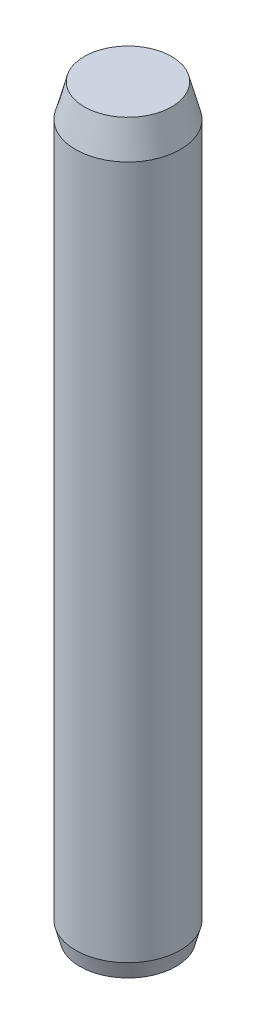
ISO-10303-21;
HEADER;
FILE_DESCRIPTION(('STEP AP214'),'2;1');
FILE_NAME('part.step','',(''),(''),'','','');
FILE_SCHEMA(('AUTOMOTIVE_DESIGN { 1 0 10303 214 1 1 1 1 }'));
ENDSEC;
DATA;
#1=APPLICATION_CONTEXT('core data for automotive mechanical design processes');
#2=APPLICATION_PROTOCOL_DEFINITION('international standard','automotive_design',2000,#1);
#3=PRODUCT_CONTEXT('',#1,'mechanical');
#4=PRODUCT('Part','Part','',(#3));
#5=PRODUCT_RELATED_PRODUCT_CATEGORY('part','',(#4));
#6=PRODUCT_DEFINITION_FORMATION('','',#4);
#7=PRODUCT_DEFINITION_CONTEXT('part definition',#1,'design');
#8=PRODUCT_DEFINITION('design','',#6,#7);
#9=PRODUCT_DEFINITION_SHAPE('','',#8);
#10=(LENGTH_UNIT() NAMED_UNIT(*) SI_UNIT(.MILLI.,.METRE.));
#11=(NAMED_UNIT(*) PLANE_ANGLE_UNIT() SI_UNIT($,.RADIAN.));
#12=(NAMED_UNIT(*) SI_UNIT($,.STERADIAN.) SOLID_ANGLE_UNIT());
#13=UNCERTAINTY_MEASURE_WITH_UNIT(LENGTH_MEASURE(1.E-05),#10,'distance_accuracy_value','');
#14=(GEOMETRIC_REPRESENTATION_CONTEXT(3) GLOBAL_UNCERTAINTY_ASSIGNED_CONTEXT((#13)) GLOBAL_UNIT_ASSIGNED_CONTEXT((#10,
#11,#12)) REPRESENTATION_CONTEXT('',''));
#15=CARTESIAN_POINT('',(0.,0.,0.));
#16=DIRECTION('',(0.,0.,1.));
#17=DIRECTION('',(1.,0.,0.));
#18=AXIS2_PLACEMENT_3D('',#15,#16,#17);
#19=CARTESIAN_POINT('',(0.,170.,0.));
#20=DIRECTION('',(0.,-1.,0.));
#21=DIRECTION('',(0.,0.,-1.));
#22=AXIS2_PLACEMENT_3D('',#19,#20,#21);
#23=CYLINDRICAL_SURFACE('',#22,12.);
#24=CARTESIAN_POINT('',(0.,3.73205080756889,0.));
#25=DIRECTION('',(0.,1.,0.));
#26=DIRECTION('',(0.,0.,1.));
#27=AXIS2_PLACEMENT_3D('',#24,#25,#26);
#28=CIRCLE('',#27,12.);
#29=CARTESIAN_POINT('',(0.,3.73205080756889,12.));
#30=VERTEX_POINT('',#29);
#31=EDGE_CURVE('E48',#30,#30,#28,.T.);
#32=ORIENTED_EDGE('',*,*,#31,.T.);
#33=EDGE_LOOP('',(#32));
#34=FACE_BOUND('',#33,.T.);
#35=CARTESIAN_POINT('',(0.,162.535898384862,0.));
#36=DIRECTION('',(0.,1.,0.));
#37=DIRECTION('',(0.,0.,1.));
#38=AXIS2_PLACEMENT_3D('',#35,#36,#37);
#39=CIRCLE('',#38,12.);
#40=CARTESIAN_POINT('',(0.,162.535898384862,12.));
#41=VERTEX_POINT('',#40);
#42=EDGE_CURVE('E52',#41,#41,#39,.F.);
#43=ORIENTED_EDGE('',*,*,#42,.T.);
#44=EDGE_LOOP('',(#43));
#45=FACE_BOUND('',#44,.T.);
#46=ADVANCED_FACE('F40',(#34,#45),#23,.T.);
#47=CARTESIAN_POINT('',(0.,170.,0.));
#48=DIRECTION('',(0.,1.,0.));
#49=DIRECTION('',(0.,0.,1.));
#50=AXIS2_PLACEMENT_3D('',#47,#48,#49);
#51=PLANE('',#50);
#52=CARTESIAN_POINT('',(0.,170.,0.));
#53=DIRECTION('',(0.,1.,0.));
#54=DIRECTION('',(0.,0.,1.));
#55=AXIS2_PLACEMENT_3D('',#52,#53,#54);
#56=CIRCLE('',#55,10.);
#57=CARTESIAN_POINT('',(0.,170.,10.));
#58=VERTEX_POINT('',#57);
#59=EDGE_CURVE('E56',#58,#58,#56,.T.);
#60=ORIENTED_EDGE('',*,*,#59,.T.);
#61=EDGE_LOOP('',(#60));
#62=FACE_BOUND('',#61,.T.);
#63=ADVANCED_FACE('F62',(#62),#51,.T.);
#64=CARTESIAN_POINT('',(0.,0.,0.));
#65=DIRECTION('',(0.,1.,0.));
#66=DIRECTION('',(0.,0.,1.));
#67=AXIS2_PLACEMENT_3D('',#64,#65,#66);
#68=PLANE('',#67);
#69=CARTESIAN_POINT('',(0.,0.,0.));
#70=DIRECTION('',(0.,1.,0.));
#71=DIRECTION('',(0.,0.,1.));
#72=AXIS2_PLACEMENT_3D('',#69,#70,#71);
#73=CIRCLE('',#72,11.);
#74=CARTESIAN_POINT('',(0.,0.,11.));
#75=VERTEX_POINT('',#74);
#76=EDGE_CURVE('E10',#75,#75,#73,.F.);
#77=ORIENTED_EDGE('',*,*,#76,.T.);
#78=EDGE_LOOP('',(#77));
#79=FACE_BOUND('',#78,.T.);
#80=ADVANCED_FACE('F66',(#79),#68,.F.);
#81=CARTESIAN_POINT('',(0.,170.,0.));
#82=DIRECTION('',(0.,-1.,0.));
#83=DIRECTION('',(0.,0.,-1.));
#84=AXIS2_PLACEMENT_3D('',#81,#82,#83);
#85=CONICAL_SURFACE('',#84,10.,0.261799387799147);
#86=ORIENTED_EDGE('',*,*,#42,.F.);
#87=EDGE_LOOP('',(#86));
#88=FACE_BOUND('',#87,.T.);
#89=ORIENTED_EDGE('',*,*,#59,.F.);
#90=EDGE_LOOP('',(#89));
#91=FACE_BOUND('',#90,.T.);
#92=ADVANCED_FACE('F64',(#88,#91),#85,.T.);
#93=CARTESIAN_POINT('',(0.,3.73205080756889,0.));
#94=DIRECTION('',(0.,1.,0.));
#95=DIRECTION('',(0.,0.,1.));
#96=AXIS2_PLACEMENT_3D('',#93,#94,#95);
#97=CONICAL_SURFACE('',#96,12.,0.261799387799149);
#98=CARTESIAN_POINT('',(0.,0.,11.));
#99=CARTESIAN_POINT('',(0.,0.0388755292455088,11.0104166666667));
#100=CARTESIAN_POINT('',(0.,0.0777510584910181,11.0208333333333));
#101=CARTESIAN_POINT('',(0.,0.155502116982037,11.0416666666667));
#102=CARTESIAN_POINT('',(0.,0.194377646227546,11.0520833333333));
#103=CARTESIAN_POINT('',(0.,0.272128704718564,11.0729166666667));
#104=CARTESIAN_POINT('',(0.,0.311004233964074,11.0833333333333));
#105=CARTESIAN_POINT('',(0.,0.388755292455092,11.1041666666667));
#106=CARTESIAN_POINT('',(0.,0.427630821700601,11.1145833333333));
#107=CARTESIAN_POINT('',(0.,0.50538188019162,11.1354166666667));
#108=CARTESIAN_POINT('',(0.,0.544257409437129,11.1458333333333));
#109=CARTESIAN_POINT('',(0.,0.622008467928147,11.1666666666667));
#110=CARTESIAN_POINT('',(0.,0.660883997173657,11.1770833333333));
#111=CARTESIAN_POINT('',(0.,0.738635055664675,11.1979166666667));
#112=CARTESIAN_POINT('',(0.,0.777510584910184,11.2083333333333));
#113=CARTESIAN_POINT('',(0.,0.855261643401203,11.2291666666667));
#114=CARTESIAN_POINT('',(0.,0.894137172646712,11.2395833333333));
#115=CARTESIAN_POINT('',(0.,0.971888231137731,11.2604166666667));
#116=CARTESIAN_POINT('',(0.,1.01076376038324,11.2708333333333));
#117=CARTESIAN_POINT('',(0.,1.08851481887426,11.2916666666667));
#118=CARTESIAN_POINT('',(0.,1.12739034811977,11.3020833333333));
#119=CARTESIAN_POINT('',(0.,1.20514140661079,11.3229166666667));
#120=CARTESIAN_POINT('',(0.,1.2440169358563,11.3333333333333));
#121=CARTESIAN_POINT('',(0.,1.32176799434731,11.3541666666667));
#122=CARTESIAN_POINT('',(0.,1.36064352359282,11.3645833333333));
#123=CARTESIAN_POINT('',(0.,1.43839458208384,11.3854166666667));
#124=CARTESIAN_POINT('',(0.,1.47727011132935,11.3958333333333));
#125=CARTESIAN_POINT('',(0.,1.55502116982037,11.4166666666667));
#126=CARTESIAN_POINT('',(0.,1.59389669906588,11.4270833333333));
#127=CARTESIAN_POINT('',(0.,1.6716477575569,11.4479166666667));
#128=CARTESIAN_POINT('',(0.,1.71052328680241,11.4583333333333));
#129=CARTESIAN_POINT('',(0.,1.78827434529342,11.4791666666667));
#130=CARTESIAN_POINT('',(0.,1.82714987453893,11.4895833333333));
#131=CARTESIAN_POINT('',(0.,1.90490093302995,11.5104166666667));
#132=CARTESIAN_POINT('',(0.,1.94377646227546,11.5208333333333));
#133=CARTESIAN_POINT('',(0.,2.02152752076648,11.5416666666667));
#134=CARTESIAN_POINT('',(0.,2.06040305001199,11.5520833333333));
#135=CARTESIAN_POINT('',(0.,2.13815410850301,11.5729166666667));
#136=CARTESIAN_POINT('',(0.,2.17702963774852,11.5833333333333));
#137=CARTESIAN_POINT('',(0.,2.25478069623954,11.6041666666667));
#138=CARTESIAN_POINT('',(0.,2.29365622548505,11.6145833333333));
#139=CARTESIAN_POINT('',(0.,2.37140728397606,11.6354166666667));
#140=CARTESIAN_POINT('',(0.,2.41028281322157,11.6458333333333));
#141=CARTESIAN_POINT('',(0.,2.48803387171259,11.6666666666667));
#142=CARTESIAN_POINT('',(0.,2.5269094009581,11.6770833333333));
#143=CARTESIAN_POINT('',(0.,2.60466045944912,11.6979166666667));
#144=CARTESIAN_POINT('',(0.,2.64353598869463,11.7083333333333));
#145=CARTESIAN_POINT('',(0.,2.72128704718565,11.7291666666667));
#146=CARTESIAN_POINT('',(0.,2.76016257643116,11.7395833333333));
#147=CARTESIAN_POINT('',(0.,2.83791363492217,11.7604166666667));
#148=CARTESIAN_POINT('',(0.,2.87678916416768,11.7708333333333));
#149=CARTESIAN_POINT('',(0.,2.9545402226587,11.7916666666667));
#150=CARTESIAN_POINT('',(0.,2.99341575190421,11.8020833333333));
#151=CARTESIAN_POINT('',(0.,3.07116681039523,11.8229166666667));
#152=CARTESIAN_POINT('',(0.,3.11004233964074,11.8333333333333));
#153=CARTESIAN_POINT('',(0.,3.18779339813176,11.8541666666667));
#154=CARTESIAN_POINT('',(0.,3.22666892737727,11.8645833333333));
#155=CARTESIAN_POINT('',(0.,3.30441998586829,11.8854166666667));
#156=CARTESIAN_POINT('',(0.,3.34329551511379,11.8958333333333));
#157=CARTESIAN_POINT('',(0.,3.42104657360481,11.9166666666667));
#158=CARTESIAN_POINT('',(0.,3.45992210285032,11.9270833333333));
#159=CARTESIAN_POINT('',(0.,3.53767316134134,11.9479166666667));
#160=CARTESIAN_POINT('',(0.,3.57654869058685,11.9583333333333));
#161=CARTESIAN_POINT('',(0.,3.65429974907787,11.9791666666667));
#162=CARTESIAN_POINT('',(0.,3.69317527832338,11.9895833333333));
#163=CARTESIAN_POINT('',(0.,3.73205080756889,12.));
#164=B_SPLINE_CURVE_WITH_KNOTS('',3,(#98,#99,#100,#101,#102,#103,#104,#105,#106,#107,#108,#109,
#110,#111,#112,#113,#114,#115,#116,#117,#118,#119,#120,#121,#122,#123,#124,#125,#126,#127,#128,
#129,#130,#131,#132,#133,#134,#135,#136,#137,#138,#139,#140,#141,#142,#143,#144,#145,#146,#147,
#148,#149,#150,#151,#152,#153,#154,#155,#156,#157,#158,#159,#160,#161,#162,#163),.UNSPECIFIED.,
.F.,.F.,(4,2,2,2,2,2,2,2,2,2,2,2,2,2,2,2,2,2,2,2,2,2,2,2,2,2,2,2,2,2,2,2,4),(0.,
0.120740728286134,0.241481456572268,0.362222184858402,0.482962913144535,0.603703641430669,
0.724444369716803,0.845185098002937,0.965925826289071,1.0866665545752,1.20740728286134,
1.32814801114747,1.44888873943361,1.56962946771974,1.69037019600587,1.81111092429201,
1.93185165257814,2.05259238086428,2.17333310915041,2.29407383743654,2.41481456572268,
2.53555529400881,2.65629602229495,2.77703675058108,2.89777747886721,3.01851820715335,
3.13925893543948,3.25999966372561,3.38074039201175,3.50148112029788,3.62222184858402,
3.74296257687015,3.86370330515628),.UNSPECIFIED.);
#165=EDGE_CURVE('BSEAM43',#75,#30,#164,.T.);
#166=ORIENTED_EDGE('',*,*,#76,.F.);
#167=ORIENTED_EDGE('',*,*,#31,.F.);
#168=ORIENTED_EDGE('',*,*,#165,.T.);
#169=ORIENTED_EDGE('',*,*,#165,.F.);
#170=EDGE_LOOP('',(#166,#168,#167,#169));
#171=FACE_BOUND('',#170,.T.);
#172=ADVANCED_FACE('F43',(#171),#97,.T.);
#173=CLOSED_SHELL('',(#46,#63,#80,#92,#172));
#174=MANIFOLD_SOLID_BREP('B2',#173);
#175=ADVANCED_BREP_SHAPE_REPRESENTATION('',(#18,#174),#14);
#176=SHAPE_DEFINITION_REPRESENTATION(#9,#175);
ENDSEC;
END-ISO-10303-21;
